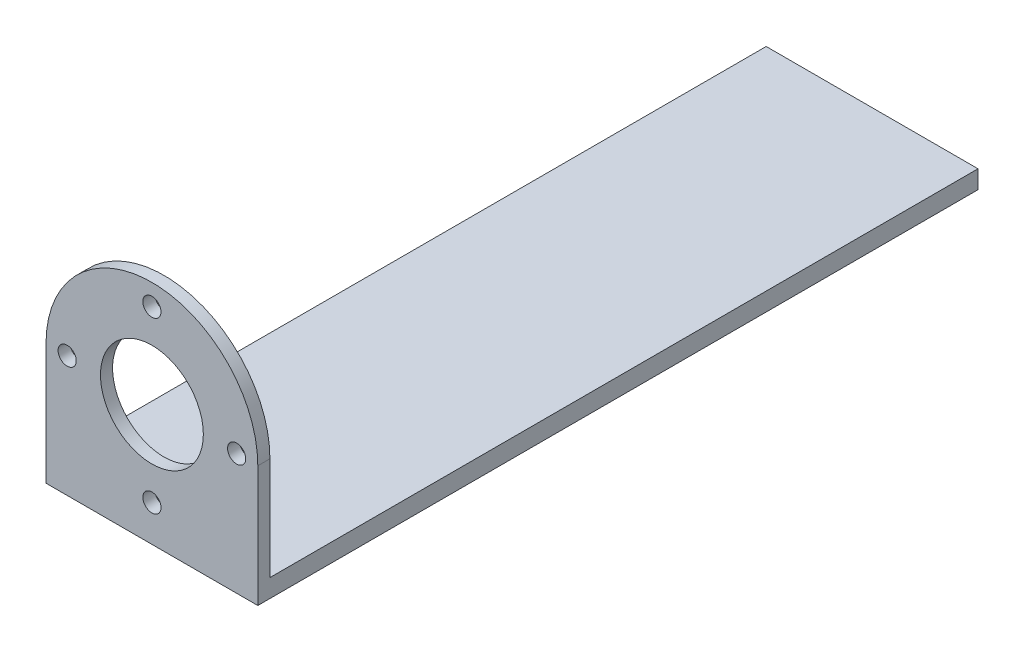
ISO-10303-21;
HEADER;
FILE_DESCRIPTION(('STEP AP214'),'2;1');
FILE_NAME('part.step','',(''),(''),'','','');
FILE_SCHEMA(('AUTOMOTIVE_DESIGN { 1 0 10303 214 1 1 1 1 }'));
ENDSEC;
DATA;
#1=APPLICATION_CONTEXT('core data for automotive mechanical design processes');
#2=APPLICATION_PROTOCOL_DEFINITION('international standard','automotive_design',2000,#1);
#3=PRODUCT_CONTEXT('',#1,'mechanical');
#4=PRODUCT('Part','Part','',(#3));
#5=PRODUCT_RELATED_PRODUCT_CATEGORY('part','',(#4));
#6=PRODUCT_DEFINITION_FORMATION('','',#4);
#7=PRODUCT_DEFINITION_CONTEXT('part definition',#1,'design');
#8=PRODUCT_DEFINITION('design','',#6,#7);
#9=PRODUCT_DEFINITION_SHAPE('','',#8);
#10=(LENGTH_UNIT() NAMED_UNIT(*) SI_UNIT(.MILLI.,.METRE.));
#11=(NAMED_UNIT(*) PLANE_ANGLE_UNIT() SI_UNIT($,.RADIAN.));
#12=(NAMED_UNIT(*) SI_UNIT($,.STERADIAN.) SOLID_ANGLE_UNIT());
#13=UNCERTAINTY_MEASURE_WITH_UNIT(LENGTH_MEASURE(1.E-05),#10,'distance_accuracy_value','');
#14=(GEOMETRIC_REPRESENTATION_CONTEXT(3) GLOBAL_UNCERTAINTY_ASSIGNED_CONTEXT((#13)) GLOBAL_UNIT_ASSIGNED_CONTEXT((#10,
#11,#12)) REPRESENTATION_CONTEXT('',''));
#15=CARTESIAN_POINT('',(0.,0.,0.));
#16=DIRECTION('',(0.,0.,1.));
#17=DIRECTION('',(1.,0.,0.));
#18=AXIS2_PLACEMENT_3D('',#15,#16,#17);
#19=CARTESIAN_POINT('',(0.,0.,0.));
#20=DIRECTION('',(0.,0.,1.));
#21=DIRECTION('',(1.,0.,0.));
#22=AXIS2_PLACEMENT_3D('',#19,#20,#21);
#23=PLANE('',#22);
#24=CARTESIAN_POINT('',(-14.,0.,0.));
#25=DIRECTION('',(0.,0.,1.));
#26=DIRECTION('',(1.,0.,0.));
#27=AXIS2_PLACEMENT_3D('',#24,#25,#26);
#28=CIRCLE('',#27,1.50000000000026);
#29=CARTESIAN_POINT('',(-12.4999999999997,0.,0.));
#30=VERTEX_POINT('',#29);
#31=EDGE_CURVE('E126',#30,#30,#28,.T.);
#32=ORIENTED_EDGE('',*,*,#31,.T.);
#33=EDGE_LOOP('',(#32));
#34=FACE_BOUND('',#33,.T.);
#35=CARTESIAN_POINT('',(0.,-14.,0.));
#36=DIRECTION('',(0.,0.,1.));
#37=DIRECTION('',(1.,0.,0.));
#38=AXIS2_PLACEMENT_3D('',#35,#36,#37);
#39=CIRCLE('',#38,1.50000000000075);
#40=CARTESIAN_POINT('',(1.50000000000076,-14.,0.));
#41=VERTEX_POINT('',#40);
#42=EDGE_CURVE('E125',#41,#41,#39,.T.);
#43=ORIENTED_EDGE('',*,*,#42,.T.);
#44=EDGE_LOOP('',(#43));
#45=FACE_BOUND('',#44,.T.);
#46=CARTESIAN_POINT('',(14.,0.,0.));
#47=DIRECTION('',(0.,0.,1.));
#48=DIRECTION('',(1.,0.,0.));
#49=AXIS2_PLACEMENT_3D('',#46,#47,#48);
#50=CIRCLE('',#49,1.50000000000049);
#51=CARTESIAN_POINT('',(15.5000000000005,0.,0.));
#52=VERTEX_POINT('',#51);
#53=EDGE_CURVE('E132',#52,#52,#50,.T.);
#54=ORIENTED_EDGE('',*,*,#53,.T.);
#55=EDGE_LOOP('',(#54));
#56=FACE_BOUND('',#55,.T.);
#57=CARTESIAN_POINT('',(0.,14.,0.));
#58=DIRECTION('',(0.,0.,1.));
#59=DIRECTION('',(1.,0.,0.));
#60=AXIS2_PLACEMENT_3D('',#57,#58,#59);
#61=CIRCLE('',#60,1.5);
#62=CARTESIAN_POINT('',(1.5,14.,0.));
#63=VERTEX_POINT('',#62);
#64=EDGE_CURVE('E138',#63,#63,#61,.T.);
#65=ORIENTED_EDGE('',*,*,#64,.T.);
#66=EDGE_LOOP('',(#65));
#67=FACE_BOUND('',#66,.T.);
#68=CARTESIAN_POINT('',(0.,0.,0.));
#69=DIRECTION('',(0.,0.,1.));
#70=DIRECTION('',(1.,0.,0.));
#71=AXIS2_PLACEMENT_3D('',#68,#69,#70);
#72=CIRCLE('',#71,8.5);
#73=CARTESIAN_POINT('',(8.5,0.,0.));
#74=VERTEX_POINT('',#73);
#75=EDGE_CURVE('E144',#74,#74,#72,.T.);
#76=ORIENTED_EDGE('',*,*,#75,.T.);
#77=EDGE_LOOP('',(#76));
#78=FACE_BOUND('',#77,.T.);
#79=DIRECTION('',(1.,0.,0.));
#80=VECTOR('',#79,1.);
#81=CARTESIAN_POINT('',(17.5,-17.,0.));
#82=LINE('',#81,#80);
#83=CARTESIAN_POINT('',(-17.5,-17.,0.));
#84=VERTEX_POINT('',#83);
#85=CARTESIAN_POINT('',(17.5,-17.,0.));
#86=VERTEX_POINT('',#85);
#87=EDGE_CURVE('E52',#84,#86,#82,.T.);
#88=ORIENTED_EDGE('',*,*,#87,.F.);
#89=DIRECTION('',(0.,-1.,0.));
#90=VECTOR('',#89,1.);
#91=CARTESIAN_POINT('',(-17.5,0.,0.));
#92=LINE('',#91,#90);
#93=CARTESIAN_POINT('',(-17.5,0.,0.));
#94=VERTEX_POINT('',#93);
#95=EDGE_CURVE('E153',#94,#84,#92,.T.);
#96=ORIENTED_EDGE('',*,*,#95,.F.);
#97=CARTESIAN_POINT('',(0.,0.,0.));
#98=DIRECTION('',(0.,0.,1.));
#99=DIRECTION('',(1.,0.,0.));
#100=AXIS2_PLACEMENT_3D('',#97,#98,#99);
#101=CIRCLE('',#100,17.5);
#102=CARTESIAN_POINT('',(17.5,0.,0.));
#103=VERTEX_POINT('',#102);
#104=EDGE_CURVE('E76',#103,#94,#101,.T.);
#105=ORIENTED_EDGE('',*,*,#104,.F.);
#106=DIRECTION('',(0.,1.,0.));
#107=VECTOR('',#106,1.);
#108=CARTESIAN_POINT('',(17.5,-20.,0.));
#109=LINE('',#108,#107);
#110=EDGE_CURVE('E95',#86,#103,#109,.T.);
#111=ORIENTED_EDGE('',*,*,#110,.F.);
#112=EDGE_LOOP('',(#88,#96,#105,#111));
#113=FACE_BOUND('',#112,.T.);
#114=ADVANCED_FACE('F37',(#34,#45,#56,#67,#78,#113),#23,.F.);
#115=CARTESIAN_POINT('',(0.,0.,2.));
#116=DIRECTION('',(0.,0.,1.));
#117=DIRECTION('',(1.,0.,0.));
#118=AXIS2_PLACEMENT_3D('',#115,#116,#117);
#119=PLANE('',#118);
#120=CARTESIAN_POINT('',(0.,-14.,2.));
#121=DIRECTION('',(0.,0.,1.));
#122=DIRECTION('',(1.,0.,0.));
#123=AXIS2_PLACEMENT_3D('',#120,#121,#122);
#124=CIRCLE('',#123,1.50000000000075);
#125=CARTESIAN_POINT('',(1.50000000000076,-14.,2.));
#126=VERTEX_POINT('',#125);
#127=EDGE_CURVE('E129',#126,#126,#124,.T.);
#128=ORIENTED_EDGE('',*,*,#127,.F.);
#129=EDGE_LOOP('',(#128));
#130=FACE_BOUND('',#129,.T.);
#131=CARTESIAN_POINT('',(0.,14.,2.));
#132=DIRECTION('',(0.,0.,1.));
#133=DIRECTION('',(1.,0.,0.));
#134=AXIS2_PLACEMENT_3D('',#131,#132,#133);
#135=CIRCLE('',#134,1.5);
#136=CARTESIAN_POINT('',(1.5,14.,2.));
#137=VERTEX_POINT('',#136);
#138=EDGE_CURVE('E141',#137,#137,#135,.T.);
#139=ORIENTED_EDGE('',*,*,#138,.F.);
#140=EDGE_LOOP('',(#139));
#141=FACE_BOUND('',#140,.T.);
#142=DIRECTION('',(0.,1.,0.));
#143=VECTOR('',#142,1.);
#144=CARTESIAN_POINT('',(17.5,-20.,2.));
#145=LINE('',#144,#143);
#146=CARTESIAN_POINT('',(17.5,-20.,2.));
#147=VERTEX_POINT('',#146);
#148=CARTESIAN_POINT('',(17.5,0.,2.));
#149=VERTEX_POINT('',#148);
#150=EDGE_CURVE('E151',#147,#149,#145,.T.);
#151=ORIENTED_EDGE('',*,*,#150,.T.);
#152=CARTESIAN_POINT('',(0.,0.,2.));
#153=DIRECTION('',(0.,0.,1.));
#154=DIRECTION('',(1.,0.,0.));
#155=AXIS2_PLACEMENT_3D('',#152,#153,#154);
#156=CIRCLE('',#155,17.5);
#157=CARTESIAN_POINT('',(-17.5,0.,2.));
#158=VERTEX_POINT('',#157);
#159=EDGE_CURVE('E81',#149,#158,#156,.T.);
#160=ORIENTED_EDGE('',*,*,#159,.T.);
#161=DIRECTION('',(0.,-1.,0.));
#162=VECTOR('',#161,1.);
#163=CARTESIAN_POINT('',(-17.5,0.,2.));
#164=LINE('',#163,#162);
#165=CARTESIAN_POINT('',(-17.5,-20.,2.));
#166=VERTEX_POINT('',#165);
#167=EDGE_CURVE('E155',#158,#166,#164,.T.);
#168=ORIENTED_EDGE('',*,*,#167,.T.);
#169=DIRECTION('',(1.,0.,0.));
#170=VECTOR('',#169,1.);
#171=CARTESIAN_POINT('',(-17.5,-20.,2.));
#172=LINE('',#171,#170);
#173=EDGE_CURVE('E61',#166,#147,#172,.T.);
#174=ORIENTED_EDGE('',*,*,#173,.T.);
#175=EDGE_LOOP('',(#151,#160,#168,#174));
#176=FACE_BOUND('',#175,.T.);
#177=CARTESIAN_POINT('',(0.,0.,2.));
#178=DIRECTION('',(0.,0.,1.));
#179=DIRECTION('',(1.,0.,0.));
#180=AXIS2_PLACEMENT_3D('',#177,#178,#179);
#181=CIRCLE('',#180,8.5);
#182=CARTESIAN_POINT('',(8.5,0.,2.));
#183=VERTEX_POINT('',#182);
#184=EDGE_CURVE('E99',#183,#183,#181,.T.);
#185=ORIENTED_EDGE('',*,*,#184,.F.);
#186=EDGE_LOOP('',(#185));
#187=FACE_BOUND('',#186,.T.);
#188=CARTESIAN_POINT('',(14.,0.,2.));
#189=DIRECTION('',(0.,0.,1.));
#190=DIRECTION('',(1.,0.,0.));
#191=AXIS2_PLACEMENT_3D('',#188,#189,#190);
#192=CIRCLE('',#191,1.50000000000049);
#193=CARTESIAN_POINT('',(15.5000000000005,0.,2.));
#194=VERTEX_POINT('',#193);
#195=EDGE_CURVE('E135',#194,#194,#192,.T.);
#196=ORIENTED_EDGE('',*,*,#195,.F.);
#197=EDGE_LOOP('',(#196));
#198=FACE_BOUND('',#197,.T.);
#199=CARTESIAN_POINT('',(-14.,0.,2.));
#200=DIRECTION('',(0.,0.,1.));
#201=DIRECTION('',(1.,0.,0.));
#202=AXIS2_PLACEMENT_3D('',#199,#200,#201);
#203=CIRCLE('',#202,1.50000000000026);
#204=CARTESIAN_POINT('',(-12.4999999999997,0.,2.));
#205=VERTEX_POINT('',#204);
#206=EDGE_CURVE('E122',#205,#205,#203,.T.);
#207=ORIENTED_EDGE('',*,*,#206,.F.);
#208=EDGE_LOOP('',(#207));
#209=FACE_BOUND('',#208,.T.);
#210=ADVANCED_FACE('F175',(#130,#141,#176,#187,#198,#209),#119,.T.);
#211=CARTESIAN_POINT('',(17.5,-20.,2.));
#212=DIRECTION('',(-1.,0.,0.));
#213=DIRECTION('',(0.,0.,1.));
#214=AXIS2_PLACEMENT_3D('',#211,#212,#213);
#215=PLANE('',#214);
#216=DIRECTION('',(0.,0.,-1.));
#217=VECTOR('',#216,1.);
#218=CARTESIAN_POINT('',(17.5,-20.,2.));
#219=LINE('',#218,#217);
#220=CARTESIAN_POINT('',(17.5,-20.,-117.));
#221=VERTEX_POINT('',#220);
#222=EDGE_CURVE('E157',#147,#221,#219,.T.);
#223=ORIENTED_EDGE('',*,*,#222,.T.);
#224=DIRECTION('',(0.,1.,0.));
#225=VECTOR('',#224,1.);
#226=CARTESIAN_POINT('',(17.5,-20.,-117.));
#227=LINE('',#226,#225);
#228=CARTESIAN_POINT('',(17.5,-17.,-117.));
#229=VERTEX_POINT('',#228);
#230=EDGE_CURVE('E105',#221,#229,#227,.T.);
#231=ORIENTED_EDGE('',*,*,#230,.T.);
#232=DIRECTION('',(0.,0.,1.));
#233=VECTOR('',#232,1.);
#234=CARTESIAN_POINT('',(17.5,-17.,-152.128336140501));
#235=LINE('',#234,#233);
#236=EDGE_CURVE('E103',#229,#86,#235,.T.);
#237=ORIENTED_EDGE('',*,*,#236,.T.);
#238=ORIENTED_EDGE('',*,*,#110,.T.);
#239=DIRECTION('',(0.,0.,-1.));
#240=VECTOR('',#239,1.);
#241=CARTESIAN_POINT('',(17.5,0.,2.));
#242=LINE('',#241,#240);
#243=EDGE_CURVE('E11',#149,#103,#242,.T.);
#244=ORIENTED_EDGE('',*,*,#243,.F.);
#245=ORIENTED_EDGE('',*,*,#150,.F.);
#246=EDGE_LOOP('',(#223,#231,#237,#238,#244,#245));
#247=FACE_BOUND('',#246,.T.);
#248=ADVANCED_FACE('F39',(#247),#215,.F.);
#249=CARTESIAN_POINT('',(0.,0.,2.));
#250=DIRECTION('',(0.,0.,-1.));
#251=DIRECTION('',(-1.,0.,0.));
#252=AXIS2_PLACEMENT_3D('',#249,#250,#251);
#253=CYLINDRICAL_SURFACE('',#252,17.5);
#254=ORIENTED_EDGE('',*,*,#104,.T.);
#255=DIRECTION('',(0.,0.,-1.));
#256=VECTOR('',#255,1.);
#257=CARTESIAN_POINT('',(-17.5,0.,2.));
#258=LINE('',#257,#256);
#259=EDGE_CURVE('E45',#158,#94,#258,.T.);
#260=ORIENTED_EDGE('',*,*,#259,.F.);
#261=ORIENTED_EDGE('',*,*,#159,.F.);
#262=ORIENTED_EDGE('',*,*,#243,.T.);
#263=EDGE_LOOP('',(#254,#260,#261,#262));
#264=FACE_BOUND('',#263,.T.);
#265=ADVANCED_FACE('F167',(#264),#253,.T.);
#266=CARTESIAN_POINT('',(-17.5,0.,2.));
#267=DIRECTION('',(1.,0.,0.));
#268=DIRECTION('',(0.,0.,-1.));
#269=AXIS2_PLACEMENT_3D('',#266,#267,#268);
#270=PLANE('',#269);
#271=ORIENTED_EDGE('',*,*,#95,.T.);
#272=DIRECTION('',(0.,0.,1.));
#273=VECTOR('',#272,1.);
#274=CARTESIAN_POINT('',(-17.5,-17.,-152.128336140501));
#275=LINE('',#274,#273);
#276=CARTESIAN_POINT('',(-17.5,-17.,-117.));
#277=VERTEX_POINT('',#276);
#278=EDGE_CURVE('E108',#277,#84,#275,.T.);
#279=ORIENTED_EDGE('',*,*,#278,.F.);
#280=DIRECTION('',(0.,-1.,0.));
#281=VECTOR('',#280,1.);
#282=CARTESIAN_POINT('',(-17.5,-17.,-117.));
#283=LINE('',#282,#281);
#284=CARTESIAN_POINT('',(-17.5,-20.,-117.));
#285=VERTEX_POINT('',#284);
#286=EDGE_CURVE('E115',#277,#285,#283,.T.);
#287=ORIENTED_EDGE('',*,*,#286,.T.);
#288=DIRECTION('',(0.,0.,-1.));
#289=VECTOR('',#288,1.);
#290=CARTESIAN_POINT('',(-17.5,-20.,2.));
#291=LINE('',#290,#289);
#292=EDGE_CURVE('E162',#166,#285,#291,.T.);
#293=ORIENTED_EDGE('',*,*,#292,.F.);
#294=ORIENTED_EDGE('',*,*,#167,.F.);
#295=ORIENTED_EDGE('',*,*,#259,.T.);
#296=EDGE_LOOP('',(#271,#279,#287,#293,#294,#295));
#297=FACE_BOUND('',#296,.T.);
#298=ADVANCED_FACE('F165',(#297),#270,.F.);
#299=CARTESIAN_POINT('',(-17.5,-20.,2.));
#300=DIRECTION('',(0.,1.,0.));
#301=DIRECTION('',(0.,0.,1.));
#302=AXIS2_PLACEMENT_3D('',#299,#300,#301);
#303=PLANE('',#302);
#304=ORIENTED_EDGE('',*,*,#292,.T.);
#305=DIRECTION('',(1.,0.,0.));
#306=VECTOR('',#305,1.);
#307=CARTESIAN_POINT('',(-17.5,-20.,-117.));
#308=LINE('',#307,#306);
#309=EDGE_CURVE('E119',#285,#221,#308,.T.);
#310=ORIENTED_EDGE('',*,*,#309,.T.);
#311=ORIENTED_EDGE('',*,*,#222,.F.);
#312=ORIENTED_EDGE('',*,*,#173,.F.);
#313=EDGE_LOOP('',(#304,#310,#311,#312));
#314=FACE_BOUND('',#313,.T.);
#315=ADVANCED_FACE('F173',(#314),#303,.F.);
#316=CARTESIAN_POINT('',(0.,0.,2.));
#317=DIRECTION('',(0.,0.,-1.));
#318=DIRECTION('',(-1.,0.,0.));
#319=AXIS2_PLACEMENT_3D('',#316,#317,#318);
#320=CYLINDRICAL_SURFACE('',#319,8.5);
#321=ORIENTED_EDGE('',*,*,#184,.T.);
#322=EDGE_LOOP('',(#321));
#323=FACE_BOUND('',#322,.T.);
#324=ORIENTED_EDGE('',*,*,#75,.F.);
#325=EDGE_LOOP('',(#324));
#326=FACE_BOUND('',#325,.T.);
#327=ADVANCED_FACE('F188',(#323,#326),#320,.F.);
#328=CARTESIAN_POINT('',(0.,14.,2.));
#329=DIRECTION('',(0.,0.,-1.));
#330=DIRECTION('',(-1.,0.,0.));
#331=AXIS2_PLACEMENT_3D('',#328,#329,#330);
#332=CYLINDRICAL_SURFACE('',#331,1.5);
#333=ORIENTED_EDGE('',*,*,#138,.T.);
#334=EDGE_LOOP('',(#333));
#335=FACE_BOUND('',#334,.T.);
#336=ORIENTED_EDGE('',*,*,#64,.F.);
#337=EDGE_LOOP('',(#336));
#338=FACE_BOUND('',#337,.T.);
#339=ADVANCED_FACE('F193',(#335,#338),#332,.F.);
#340=CARTESIAN_POINT('',(14.,0.,2.));
#341=DIRECTION('',(0.,0.,-1.));
#342=DIRECTION('',(-1.,0.,0.));
#343=AXIS2_PLACEMENT_3D('',#340,#341,#342);
#344=CYLINDRICAL_SURFACE('',#343,1.50000000000049);
#345=ORIENTED_EDGE('',*,*,#195,.T.);
#346=EDGE_LOOP('',(#345));
#347=FACE_BOUND('',#346,.T.);
#348=ORIENTED_EDGE('',*,*,#53,.F.);
#349=EDGE_LOOP('',(#348));
#350=FACE_BOUND('',#349,.T.);
#351=ADVANCED_FACE('F215',(#347,#350),#344,.F.);
#352=CARTESIAN_POINT('',(0.,-14.,2.));
#353=DIRECTION('',(0.,0.,-1.));
#354=DIRECTION('',(-1.,0.,0.));
#355=AXIS2_PLACEMENT_3D('',#352,#353,#354);
#356=CYLINDRICAL_SURFACE('',#355,1.50000000000075);
#357=ORIENTED_EDGE('',*,*,#127,.T.);
#358=EDGE_LOOP('',(#357));
#359=FACE_BOUND('',#358,.T.);
#360=ORIENTED_EDGE('',*,*,#42,.F.);
#361=EDGE_LOOP('',(#360));
#362=FACE_BOUND('',#361,.T.);
#363=ADVANCED_FACE('F211',(#359,#362),#356,.F.);
#364=CARTESIAN_POINT('',(-14.,0.,2.));
#365=DIRECTION('',(0.,0.,-1.));
#366=DIRECTION('',(-1.,0.,0.));
#367=AXIS2_PLACEMENT_3D('',#364,#365,#366);
#368=CYLINDRICAL_SURFACE('',#367,1.50000000000026);
#369=ORIENTED_EDGE('',*,*,#206,.T.);
#370=EDGE_LOOP('',(#369));
#371=FACE_BOUND('',#370,.T.);
#372=ORIENTED_EDGE('',*,*,#31,.F.);
#373=EDGE_LOOP('',(#372));
#374=FACE_BOUND('',#373,.T.);
#375=ADVANCED_FACE('F206',(#371,#374),#368,.F.);
#376=CARTESIAN_POINT('',(17.5,-17.,-152.128336140501));
#377=DIRECTION('',(0.,-1.,0.));
#378=DIRECTION('',(0.,0.,-1.));
#379=AXIS2_PLACEMENT_3D('',#376,#377,#378);
#380=PLANE('',#379);
#381=ORIENTED_EDGE('',*,*,#236,.F.);
#382=DIRECTION('',(-1.,0.,0.));
#383=VECTOR('',#382,1.);
#384=CARTESIAN_POINT('',(17.5,-17.,-117.));
#385=LINE('',#384,#383);
#386=EDGE_CURVE('E199',#229,#277,#385,.T.);
#387=ORIENTED_EDGE('',*,*,#386,.T.);
#388=ORIENTED_EDGE('',*,*,#278,.T.);
#389=ORIENTED_EDGE('',*,*,#87,.T.);
#390=EDGE_LOOP('',(#381,#387,#388,#389));
#391=FACE_BOUND('',#390,.T.);
#392=ADVANCED_FACE('F111',(#391),#380,.F.);
#393=CARTESIAN_POINT('',(0.,0.,-117.));
#394=DIRECTION('',(0.,0.,1.));
#395=DIRECTION('',(1.,0.,0.));
#396=AXIS2_PLACEMENT_3D('',#393,#394,#395);
#397=PLANE('',#396);
#398=ORIENTED_EDGE('',*,*,#386,.F.);
#399=ORIENTED_EDGE('',*,*,#230,.F.);
#400=ORIENTED_EDGE('',*,*,#309,.F.);
#401=ORIENTED_EDGE('',*,*,#286,.F.);
#402=EDGE_LOOP('',(#398,#399,#400,#401));
#403=FACE_BOUND('',#402,.T.);
#404=ADVANCED_FACE('F198',(#403),#397,.F.);
#405=CLOSED_SHELL('',(#114,#210,#248,#265,#298,#315,#327,#339,#351,#363,#375,#392,#404));
#406=MANIFOLD_SOLID_BREP('B2',#405);
#407=ADVANCED_BREP_SHAPE_REPRESENTATION('',(#18,#406),#14);
#408=SHAPE_DEFINITION_REPRESENTATION(#9,#407);
ENDSEC;
END-ISO-10303-21;
